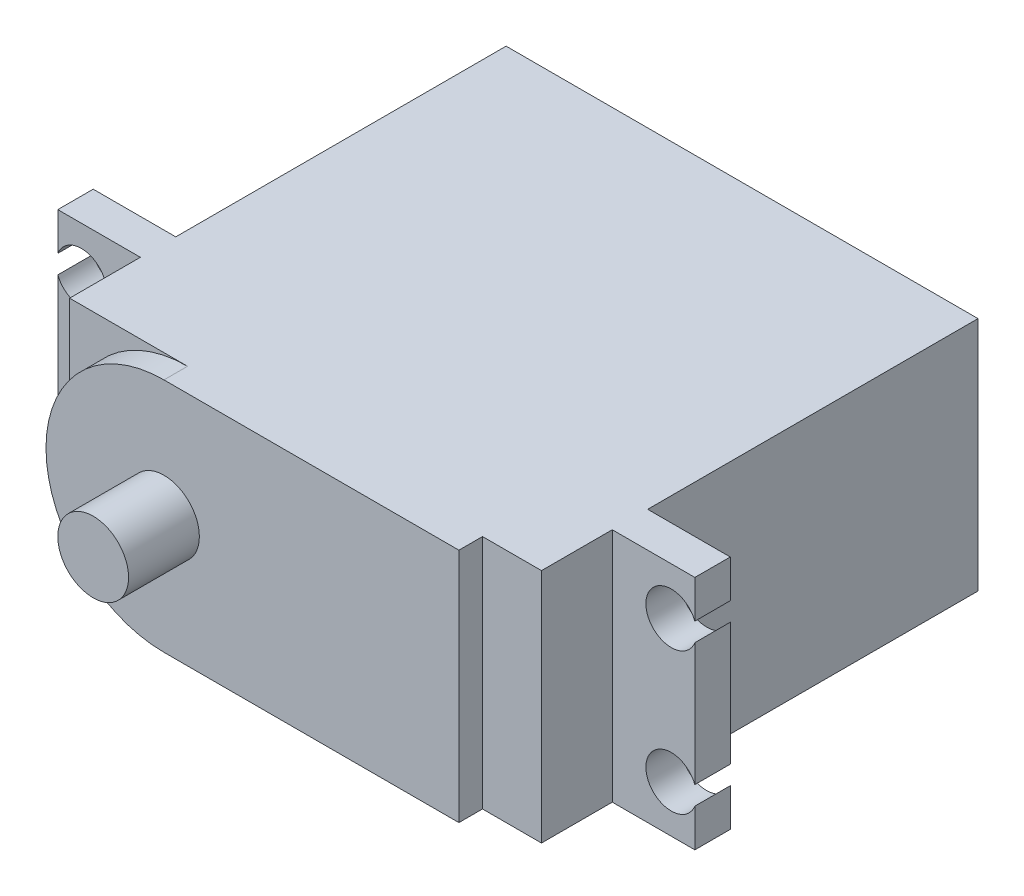
ISO-10303-21;
HEADER;
FILE_DESCRIPTION(('STEP AP214'),'2;1');
FILE_NAME('part.step','',(''),(''),'','','');
FILE_SCHEMA(('AUTOMOTIVE_DESIGN { 1 0 10303 214 1 1 1 1 }'));
ENDSEC;
DATA;
#1=APPLICATION_CONTEXT('core data for automotive mechanical design processes');
#2=APPLICATION_PROTOCOL_DEFINITION('international standard','automotive_design',2000,#1);
#3=PRODUCT_CONTEXT('',#1,'mechanical');
#4=PRODUCT('Part','Part','',(#3));
#5=PRODUCT_RELATED_PRODUCT_CATEGORY('part','',(#4));
#6=PRODUCT_DEFINITION_FORMATION('','',#4);
#7=PRODUCT_DEFINITION_CONTEXT('part definition',#1,'design');
#8=PRODUCT_DEFINITION('design','',#6,#7);
#9=PRODUCT_DEFINITION_SHAPE('','',#8);
#10=(LENGTH_UNIT() NAMED_UNIT(*) SI_UNIT(.MILLI.,.METRE.));
#11=(NAMED_UNIT(*) PLANE_ANGLE_UNIT() SI_UNIT($,.RADIAN.));
#12=(NAMED_UNIT(*) SI_UNIT($,.STERADIAN.) SOLID_ANGLE_UNIT());
#13=UNCERTAINTY_MEASURE_WITH_UNIT(LENGTH_MEASURE(1.E-05),#10,'distance_accuracy_value','');
#14=(GEOMETRIC_REPRESENTATION_CONTEXT(3) GLOBAL_UNCERTAINTY_ASSIGNED_CONTEXT((#13)) GLOBAL_UNIT_ASSIGNED_CONTEXT((#10,
#11,#12)) REPRESENTATION_CONTEXT('',''));
#15=CARTESIAN_POINT('',(0.,0.,0.));
#16=DIRECTION('',(0.,0.,1.));
#17=DIRECTION('',(1.,0.,0.));
#18=AXIS2_PLACEMENT_3D('',#15,#16,#17);
#19=CARTESIAN_POINT('',(27.,0.,0.));
#20=DIRECTION('',(1.,0.,0.));
#21=DIRECTION('',(0.,0.,-1.));
#22=AXIS2_PLACEMENT_3D('',#19,#20,#21);
#23=PLANE('',#22);
#24=DIRECTION('',(0.,0.,1.));
#25=VECTOR('',#24,1.);
#26=CARTESIAN_POINT('',(27.,-5.21101330809704,-0.001000000000001));
#27=LINE('',#26,#25);
#28=CARTESIAN_POINT('',(27.,-5.21101330809704,31.));
#29=VERTEX_POINT('',#28);
#30=CARTESIAN_POINT('',(27.,-5.21101330809704,28.));
#31=VERTEX_POINT('',#30);
#32=EDGE_CURVE('E203',#29,#31,#27,.F.);
#33=ORIENTED_EDGE('',*,*,#32,.T.);
#34=DIRECTION('',(0.,1.,0.));
#35=VECTOR('',#34,1.);
#36=CARTESIAN_POINT('',(27.,10.,28.));
#37=LINE('',#36,#35);
#38=CARTESIAN_POINT('',(27.,5.21101330809703,28.));
#39=VERTEX_POINT('',#38);
#40=EDGE_CURVE('E213',#31,#39,#37,.T.);
#41=ORIENTED_EDGE('',*,*,#40,.T.);
#42=DIRECTION('',(0.,0.,1.));
#43=VECTOR('',#42,1.);
#44=CARTESIAN_POINT('',(27.,5.21101330809703,-0.001000000000001));
#45=LINE('',#44,#43);
#46=CARTESIAN_POINT('',(27.,5.21101330809703,31.));
#47=VERTEX_POINT('',#46);
#48=EDGE_CURVE('E214',#39,#47,#45,.T.);
#49=ORIENTED_EDGE('',*,*,#48,.T.);
#50=DIRECTION('',(0.,-1.,0.));
#51=VECTOR('',#50,1.);
#52=CARTESIAN_POINT('',(27.,10.,31.));
#53=LINE('',#52,#51);
#54=EDGE_CURVE('E232',#47,#29,#53,.T.);
#55=ORIENTED_EDGE('',*,*,#54,.T.);
#56=EDGE_LOOP('',(#33,#41,#49,#55));
#57=FACE_BOUND('',#56,.T.);
#58=ADVANCED_FACE('F33',(#57),#23,.T.);
#59=DIRECTION('',(0.,0.,1.));
#60=VECTOR('',#59,1.);
#61=CARTESIAN_POINT('',(27.,6.78898669190296,-0.001000000000001));
#62=LINE('',#61,#60);
#63=CARTESIAN_POINT('',(27.,6.78898669190296,31.));
#64=VERTEX_POINT('',#63);
#65=CARTESIAN_POINT('',(27.,6.78898669190296,28.));
#66=VERTEX_POINT('',#65);
#67=EDGE_CURVE('E283',#64,#66,#62,.F.);
#68=ORIENTED_EDGE('',*,*,#67,.T.);
#69=CARTESIAN_POINT('',(27.,10.,28.));
#70=VERTEX_POINT('',#69);
#71=EDGE_CURVE('E222',#66,#70,#37,.T.);
#72=ORIENTED_EDGE('',*,*,#71,.T.);
#73=DIRECTION('',(0.,0.,1.));
#74=VECTOR('',#73,1.);
#75=CARTESIAN_POINT('',(27.,10.,31.));
#76=LINE('',#75,#74);
#77=CARTESIAN_POINT('',(27.,10.,31.));
#78=VERTEX_POINT('',#77);
#79=EDGE_CURVE('E220',#70,#78,#76,.T.);
#80=ORIENTED_EDGE('',*,*,#79,.T.);
#81=EDGE_CURVE('E230',#78,#64,#53,.T.);
#82=ORIENTED_EDGE('',*,*,#81,.T.);
#83=EDGE_LOOP('',(#68,#72,#80,#82));
#84=FACE_BOUND('',#83,.T.);
#85=ADVANCED_FACE('F424',(#84),#23,.T.);
#86=CARTESIAN_POINT('',(-27.,0.,0.));
#87=DIRECTION('',(-1.,0.,0.));
#88=DIRECTION('',(0.,0.,1.));
#89=AXIS2_PLACEMENT_3D('',#86,#87,#88);
#90=PLANE('',#89);
#91=DIRECTION('',(0.,0.,1.));
#92=VECTOR('',#91,1.);
#93=CARTESIAN_POINT('',(-27.,-6.78898669190297,-0.001000000000001));
#94=LINE('',#93,#92);
#95=CARTESIAN_POINT('',(-27.,-6.78898669190297,31.));
#96=VERTEX_POINT('',#95);
#97=CARTESIAN_POINT('',(-27.,-6.78898669190297,28.));
#98=VERTEX_POINT('',#97);
#99=EDGE_CURVE('E274',#96,#98,#94,.F.);
#100=ORIENTED_EDGE('',*,*,#99,.T.);
#101=DIRECTION('',(0.,-1.,0.));
#102=VECTOR('',#101,1.);
#103=CARTESIAN_POINT('',(-27.,10.,28.));
#104=LINE('',#103,#102);
#105=CARTESIAN_POINT('',(-27.,-10.,28.));
#106=VERTEX_POINT('',#105);
#107=EDGE_CURVE('E250',#98,#106,#104,.T.);
#108=ORIENTED_EDGE('',*,*,#107,.T.);
#109=DIRECTION('',(0.,0.,1.));
#110=VECTOR('',#109,1.);
#111=CARTESIAN_POINT('',(-27.,-10.,28.));
#112=LINE('',#111,#110);
#113=CARTESIAN_POINT('',(-27.,-10.,31.));
#114=VERTEX_POINT('',#113);
#115=EDGE_CURVE('E260',#106,#114,#112,.T.);
#116=ORIENTED_EDGE('',*,*,#115,.T.);
#117=DIRECTION('',(0.,1.,0.));
#118=VECTOR('',#117,1.);
#119=CARTESIAN_POINT('',(-27.,10.,31.));
#120=LINE('',#119,#118);
#121=EDGE_CURVE('E255',#114,#96,#120,.T.);
#122=ORIENTED_EDGE('',*,*,#121,.T.);
#123=EDGE_LOOP('',(#100,#108,#116,#122));
#124=FACE_BOUND('',#123,.T.);
#125=ADVANCED_FACE('F444',(#124),#90,.T.);
#126=DIRECTION('',(0.,0.,1.));
#127=VECTOR('',#126,1.);
#128=CARTESIAN_POINT('',(-27.,-5.21101330809704,-0.001000000000001));
#129=LINE('',#128,#127);
#130=CARTESIAN_POINT('',(-27.,-5.21101330809704,28.));
#131=VERTEX_POINT('',#130);
#132=CARTESIAN_POINT('',(-27.,-5.21101330809704,31.));
#133=VERTEX_POINT('',#132);
#134=EDGE_CURVE('E277',#131,#133,#129,.T.);
#135=ORIENTED_EDGE('',*,*,#134,.T.);
#136=CARTESIAN_POINT('',(-27.,5.21101330809703,31.));
#137=VERTEX_POINT('',#136);
#138=EDGE_CURVE('E258',#133,#137,#120,.T.);
#139=ORIENTED_EDGE('',*,*,#138,.T.);
#140=DIRECTION('',(0.,0.,1.));
#141=VECTOR('',#140,1.);
#142=CARTESIAN_POINT('',(-27.,5.21101330809703,24.));
#143=LINE('',#142,#141);
#144=CARTESIAN_POINT('',(-27.,5.21101330809703,28.));
#145=VERTEX_POINT('',#144);
#146=EDGE_CURVE('E11',#145,#137,#143,.T.);
#147=ORIENTED_EDGE('',*,*,#146,.F.);
#148=EDGE_CURVE('E265',#145,#131,#104,.T.);
#149=ORIENTED_EDGE('',*,*,#148,.T.);
#150=EDGE_LOOP('',(#135,#139,#147,#149));
#151=FACE_BOUND('',#150,.T.);
#152=ADVANCED_FACE('F479',(#151),#90,.T.);
#153=CARTESIAN_POINT('',(-20.,-10.,37.));
#154=DIRECTION('',(1.,0.,0.));
#155=DIRECTION('',(0.,0.,-1.));
#156=AXIS2_PLACEMENT_3D('',#153,#154,#155);
#157=PLANE('',#156);
#158=DIRECTION('',(0.,-1.,0.));
#159=VECTOR('',#158,1.);
#160=CARTESIAN_POINT('',(-20.,10.,28.));
#161=LINE('',#160,#159);
#162=CARTESIAN_POINT('',(-20.,10.,28.));
#163=VERTEX_POINT('',#162);
#164=CARTESIAN_POINT('',(-20.,-10.,28.));
#165=VERTEX_POINT('',#164);
#166=EDGE_CURVE('E251',#163,#165,#161,.T.);
#167=ORIENTED_EDGE('',*,*,#166,.F.);
#168=DIRECTION('',(0.,0.,-1.));
#169=VECTOR('',#168,1.);
#170=CARTESIAN_POINT('',(-20.,10.,37.));
#171=LINE('',#170,#169);
#172=CARTESIAN_POINT('',(-20.,10.,0.));
#173=VERTEX_POINT('',#172);
#174=EDGE_CURVE('E367',#163,#173,#171,.T.);
#175=ORIENTED_EDGE('',*,*,#174,.T.);
#176=DIRECTION('',(0.,-1.,0.));
#177=VECTOR('',#176,1.);
#178=CARTESIAN_POINT('',(-20.,-10.,0.));
#179=LINE('',#178,#177);
#180=CARTESIAN_POINT('',(-20.,-10.,0.));
#181=VERTEX_POINT('',#180);
#182=EDGE_CURVE('E356',#173,#181,#179,.T.);
#183=ORIENTED_EDGE('',*,*,#182,.T.);
#184=DIRECTION('',(0.,0.,-1.));
#185=VECTOR('',#184,1.);
#186=CARTESIAN_POINT('',(-20.,-10.,37.));
#187=LINE('',#186,#185);
#188=EDGE_CURVE('E363',#165,#181,#187,.T.);
#189=ORIENTED_EDGE('',*,*,#188,.F.);
#190=EDGE_LOOP('',(#167,#175,#183,#189));
#191=FACE_BOUND('',#190,.T.);
#192=ADVANCED_FACE('F476',(#191),#157,.F.);
#193=DIRECTION('',(0.,1.,0.));
#194=VECTOR('',#193,1.);
#195=CARTESIAN_POINT('',(-20.,10.,31.));
#196=LINE('',#195,#194);
#197=CARTESIAN_POINT('',(-20.,-10.,31.));
#198=VERTEX_POINT('',#197);
#199=CARTESIAN_POINT('',(-20.,10.,31.));
#200=VERTEX_POINT('',#199);
#201=EDGE_CURVE('E248',#198,#200,#196,.T.);
#202=ORIENTED_EDGE('',*,*,#201,.F.);
#203=CARTESIAN_POINT('',(-20.,-10.,37.));
#204=VERTEX_POINT('',#203);
#205=EDGE_CURVE('E364',#204,#198,#187,.T.);
#206=ORIENTED_EDGE('',*,*,#205,.F.);
#207=DIRECTION('',(0.,-1.,0.));
#208=VECTOR('',#207,1.);
#209=CARTESIAN_POINT('',(-20.,-10.,37.));
#210=LINE('',#209,#208);
#211=CARTESIAN_POINT('',(-20.,0.,37.));
#212=VERTEX_POINT('',#211);
#213=EDGE_CURVE('E347',#212,#204,#210,.T.);
#214=ORIENTED_EDGE('',*,*,#213,.F.);
#215=CARTESIAN_POINT('',(-20.,10.,37.));
#216=VERTEX_POINT('',#215);
#217=EDGE_CURVE('E348',#216,#212,#210,.T.);
#218=ORIENTED_EDGE('',*,*,#217,.F.);
#219=EDGE_CURVE('E368',#216,#200,#171,.T.);
#220=ORIENTED_EDGE('',*,*,#219,.T.);
#221=EDGE_LOOP('',(#202,#206,#214,#218,#220));
#222=FACE_BOUND('',#221,.T.);
#223=ADVANCED_FACE('F478',(#222),#157,.F.);
#224=CARTESIAN_POINT('',(20.,-10.,37.));
#225=DIRECTION('',(-1.,0.,0.));
#226=DIRECTION('',(0.,0.,1.));
#227=AXIS2_PLACEMENT_3D('',#224,#225,#226);
#228=PLANE('',#227);
#229=DIRECTION('',(0.,-1.,0.));
#230=VECTOR('',#229,1.);
#231=CARTESIAN_POINT('',(20.,10.,31.));
#232=LINE('',#231,#230);
#233=CARTESIAN_POINT('',(20.,10.,31.));
#234=VERTEX_POINT('',#233);
#235=CARTESIAN_POINT('',(20.,-10.,31.));
#236=VERTEX_POINT('',#235);
#237=EDGE_CURVE('E239',#234,#236,#232,.T.);
#238=ORIENTED_EDGE('',*,*,#237,.F.);
#239=DIRECTION('',(0.,0.,-1.));
#240=VECTOR('',#239,1.);
#241=CARTESIAN_POINT('',(20.,10.,37.));
#242=LINE('',#241,#240);
#243=CARTESIAN_POINT('',(20.,10.,37.));
#244=VERTEX_POINT('',#243);
#245=EDGE_CURVE('E372',#244,#234,#242,.T.);
#246=ORIENTED_EDGE('',*,*,#245,.F.);
#247=DIRECTION('',(0.,1.,0.));
#248=VECTOR('',#247,1.);
#249=CARTESIAN_POINT('',(20.,-10.,37.));
#250=LINE('',#249,#248);
#251=CARTESIAN_POINT('',(20.,-10.,37.));
#252=VERTEX_POINT('',#251);
#253=EDGE_CURVE('E341',#252,#244,#250,.T.);
#254=ORIENTED_EDGE('',*,*,#253,.F.);
#255=DIRECTION('',(0.,0.,-1.));
#256=VECTOR('',#255,1.);
#257=CARTESIAN_POINT('',(20.,-10.,37.));
#258=LINE('',#257,#256);
#259=EDGE_CURVE('E361',#252,#236,#258,.T.);
#260=ORIENTED_EDGE('',*,*,#259,.T.);
#261=EDGE_LOOP('',(#238,#246,#254,#260));
#262=FACE_BOUND('',#261,.T.);
#263=ADVANCED_FACE('F35',(#262),#228,.F.);
#264=DIRECTION('',(0.,1.,0.));
#265=VECTOR('',#264,1.);
#266=CARTESIAN_POINT('',(20.,10.,28.));
#267=LINE('',#266,#265);
#268=CARTESIAN_POINT('',(20.,-10.,28.));
#269=VERTEX_POINT('',#268);
#270=CARTESIAN_POINT('',(20.,10.,28.));
#271=VERTEX_POINT('',#270);
#272=EDGE_CURVE('E418',#269,#271,#267,.T.);
#273=ORIENTED_EDGE('',*,*,#272,.F.);
#274=CARTESIAN_POINT('',(20.,-10.,0.));
#275=VERTEX_POINT('',#274);
#276=EDGE_CURVE('E353',#269,#275,#258,.T.);
#277=ORIENTED_EDGE('',*,*,#276,.T.);
#278=DIRECTION('',(0.,1.,0.));
#279=VECTOR('',#278,1.);
#280=CARTESIAN_POINT('',(20.,-10.,0.));
#281=LINE('',#280,#279);
#282=CARTESIAN_POINT('',(20.,10.,0.));
#283=VERTEX_POINT('',#282);
#284=EDGE_CURVE('E330',#275,#283,#281,.T.);
#285=ORIENTED_EDGE('',*,*,#284,.T.);
#286=EDGE_CURVE('E371',#271,#283,#242,.T.);
#287=ORIENTED_EDGE('',*,*,#286,.F.);
#288=EDGE_LOOP('',(#273,#277,#285,#287));
#289=FACE_BOUND('',#288,.T.);
#290=ADVANCED_FACE('F490',(#289),#228,.F.);
#291=CARTESIAN_POINT('',(0.,0.,37.));
#292=DIRECTION('',(0.,0.,-1.));
#293=DIRECTION('',(-1.,0.,0.));
#294=AXIS2_PLACEMENT_3D('',#291,#292,#293);
#295=PLANE('',#294);
#296=DIRECTION('',(0.,1.,0.));
#297=VECTOR('',#296,1.);
#298=CARTESIAN_POINT('',(15.,10.,37.));
#299=LINE('',#298,#297);
#300=CARTESIAN_POINT('',(15.,-10.,37.));
#301=VERTEX_POINT('',#300);
#302=CARTESIAN_POINT('',(15.,10.,37.));
#303=VERTEX_POINT('',#302);
#304=EDGE_CURVE('E319',#301,#303,#299,.T.);
#305=ORIENTED_EDGE('',*,*,#304,.F.);
#306=DIRECTION('',(1.,0.,0.));
#307=VECTOR('',#306,1.);
#308=CARTESIAN_POINT('',(-20.,-10.,37.));
#309=LINE('',#308,#307);
#310=EDGE_CURVE('E351',#301,#252,#309,.T.);
#311=ORIENTED_EDGE('',*,*,#310,.T.);
#312=ORIENTED_EDGE('',*,*,#253,.T.);
#313=DIRECTION('',(-1.,0.,0.));
#314=VECTOR('',#313,1.);
#315=CARTESIAN_POINT('',(-20.,10.,37.));
#316=LINE('',#315,#314);
#317=EDGE_CURVE('E345',#244,#303,#316,.T.);
#318=ORIENTED_EDGE('',*,*,#317,.T.);
#319=EDGE_LOOP('',(#305,#311,#312,#318));
#320=FACE_BOUND('',#319,.T.);
#321=ADVANCED_FACE('F407',(#320),#295,.F.);
#322=CARTESIAN_POINT('',(-10.,0.,37.));
#323=DIRECTION('',(0.,0.,1.));
#324=DIRECTION('',(1.,0.,0.));
#325=AXIS2_PLACEMENT_3D('',#322,#323,#324);
#326=CIRCLE('',#325,10.);
#327=CARTESIAN_POINT('',(-10.,10.,37.));
#328=VERTEX_POINT('',#327);
#329=EDGE_CURVE('E379',#328,#212,#326,.T.);
#330=ORIENTED_EDGE('',*,*,#329,.F.);
#331=EDGE_CURVE('E327',#328,#216,#316,.T.);
#332=ORIENTED_EDGE('',*,*,#331,.T.);
#333=ORIENTED_EDGE('',*,*,#217,.T.);
#334=EDGE_LOOP('',(#330,#332,#333));
#335=FACE_BOUND('',#334,.T.);
#336=ADVANCED_FACE('F470',(#335),#295,.F.);
#337=CARTESIAN_POINT('',(-20.,10.,37.));
#338=DIRECTION('',(0.,-1.,0.));
#339=DIRECTION('',(0.,0.,-1.));
#340=AXIS2_PLACEMENT_3D('',#337,#338,#339);
#341=PLANE('',#340);
#342=DIRECTION('',(-1.,0.,0.));
#343=VECTOR('',#342,1.);
#344=CARTESIAN_POINT('',(-20.,10.,0.));
#345=LINE('',#344,#343);
#346=EDGE_CURVE('E334',#283,#173,#345,.T.);
#347=ORIENTED_EDGE('',*,*,#346,.T.);
#348=ORIENTED_EDGE('',*,*,#174,.F.);
#349=DIRECTION('',(1.,0.,0.));
#350=VECTOR('',#349,1.);
#351=CARTESIAN_POINT('',(-27.,10.,28.));
#352=LINE('',#351,#350);
#353=CARTESIAN_POINT('',(-27.,10.,28.));
#354=VERTEX_POINT('',#353);
#355=EDGE_CURVE('E245',#354,#163,#352,.T.);
#356=ORIENTED_EDGE('',*,*,#355,.F.);
#357=DIRECTION('',(0.,0.,-1.));
#358=VECTOR('',#357,1.);
#359=CARTESIAN_POINT('',(-27.,10.,28.));
#360=LINE('',#359,#358);
#361=CARTESIAN_POINT('',(-27.,10.,31.));
#362=VERTEX_POINT('',#361);
#363=EDGE_CURVE('E247',#362,#354,#360,.T.);
#364=ORIENTED_EDGE('',*,*,#363,.F.);
#365=DIRECTION('',(1.,0.,0.));
#366=VECTOR('',#365,1.);
#367=CARTESIAN_POINT('',(-27.,10.,31.));
#368=LINE('',#367,#366);
#369=EDGE_CURVE('E242',#362,#200,#368,.T.);
#370=ORIENTED_EDGE('',*,*,#369,.T.);
#371=ORIENTED_EDGE('',*,*,#219,.F.);
#372=ORIENTED_EDGE('',*,*,#331,.F.);
#373=DIRECTION('',(0.,0.,-1.));
#374=VECTOR('',#373,1.);
#375=CARTESIAN_POINT('',(-10.,10.,39.));
#376=LINE('',#375,#374);
#377=CARTESIAN_POINT('',(-10.,10.,39.));
#378=VERTEX_POINT('',#377);
#379=EDGE_CURVE('E323',#378,#328,#376,.T.);
#380=ORIENTED_EDGE('',*,*,#379,.F.);
#381=DIRECTION('',(-1.,0.,0.));
#382=VECTOR('',#381,1.);
#383=CARTESIAN_POINT('',(-10.,10.,39.));
#384=LINE('',#383,#382);
#385=CARTESIAN_POINT('',(15.,10.,39.));
#386=VERTEX_POINT('',#385);
#387=EDGE_CURVE('E310',#386,#378,#384,.T.);
#388=ORIENTED_EDGE('',*,*,#387,.F.);
#389=DIRECTION('',(0.,0.,-1.));
#390=VECTOR('',#389,1.);
#391=CARTESIAN_POINT('',(15.,10.,39.));
#392=LINE('',#391,#390);
#393=EDGE_CURVE('E397',#386,#303,#392,.T.);
#394=ORIENTED_EDGE('',*,*,#393,.T.);
#395=ORIENTED_EDGE('',*,*,#317,.F.);
#396=ORIENTED_EDGE('',*,*,#245,.T.);
#397=DIRECTION('',(-1.,0.,0.));
#398=VECTOR('',#397,1.);
#399=CARTESIAN_POINT('',(27.,10.,31.));
#400=LINE('',#399,#398);
#401=EDGE_CURVE('E223',#78,#234,#400,.T.);
#402=ORIENTED_EDGE('',*,*,#401,.F.);
#403=ORIENTED_EDGE('',*,*,#79,.F.);
#404=DIRECTION('',(-1.,0.,0.));
#405=VECTOR('',#404,1.);
#406=CARTESIAN_POINT('',(27.,10.,28.));
#407=LINE('',#406,#405);
#408=EDGE_CURVE('E391',#70,#271,#407,.T.);
#409=ORIENTED_EDGE('',*,*,#408,.T.);
#410=ORIENTED_EDGE('',*,*,#286,.T.);
#411=EDGE_LOOP('',(#347,#348,#356,#364,#370,#371,#372,#380,#388,#394,#395,#396,#402,#403,#409,#410));
#412=FACE_BOUND('',#411,.T.);
#413=ADVANCED_FACE('F325',(#412),#341,.F.);
#414=CARTESIAN_POINT('',(-20.,-10.,37.));
#415=DIRECTION('',(0.,1.,0.));
#416=DIRECTION('',(0.,0.,1.));
#417=AXIS2_PLACEMENT_3D('',#414,#415,#416);
#418=PLANE('',#417);
#419=DIRECTION('',(1.,0.,0.));
#420=VECTOR('',#419,1.);
#421=CARTESIAN_POINT('',(-20.,-10.,0.));
#422=LINE('',#421,#420);
#423=EDGE_CURVE('E344',#181,#275,#422,.T.);
#424=ORIENTED_EDGE('',*,*,#423,.T.);
#425=ORIENTED_EDGE('',*,*,#276,.F.);
#426=DIRECTION('',(-1.,0.,0.));
#427=VECTOR('',#426,1.);
#428=CARTESIAN_POINT('',(27.,-10.,28.));
#429=LINE('',#428,#427);
#430=CARTESIAN_POINT('',(27.,-10.,28.));
#431=VERTEX_POINT('',#430);
#432=EDGE_CURVE('E385',#431,#269,#429,.T.);
#433=ORIENTED_EDGE('',*,*,#432,.F.);
#434=DIRECTION('',(0.,0.,-1.));
#435=VECTOR('',#434,1.);
#436=CARTESIAN_POINT('',(27.,-10.,31.));
#437=LINE('',#436,#435);
#438=CARTESIAN_POINT('',(27.,-10.,31.));
#439=VERTEX_POINT('',#438);
#440=EDGE_CURVE('E218',#439,#431,#437,.T.);
#441=ORIENTED_EDGE('',*,*,#440,.F.);
#442=DIRECTION('',(-1.,0.,0.));
#443=VECTOR('',#442,1.);
#444=CARTESIAN_POINT('',(27.,-10.,31.));
#445=LINE('',#444,#443);
#446=EDGE_CURVE('E382',#439,#236,#445,.T.);
#447=ORIENTED_EDGE('',*,*,#446,.T.);
#448=ORIENTED_EDGE('',*,*,#259,.F.);
#449=ORIENTED_EDGE('',*,*,#310,.F.);
#450=DIRECTION('',(0.,0.,-1.));
#451=VECTOR('',#450,1.);
#452=CARTESIAN_POINT('',(15.,-10.,39.));
#453=LINE('',#452,#451);
#454=CARTESIAN_POINT('',(15.,-10.,39.));
#455=VERTEX_POINT('',#454);
#456=EDGE_CURVE('E337',#455,#301,#453,.T.);
#457=ORIENTED_EDGE('',*,*,#456,.F.);
#458=DIRECTION('',(1.,0.,0.));
#459=VECTOR('',#458,1.);
#460=CARTESIAN_POINT('',(-10.,-10.,39.));
#461=LINE('',#460,#459);
#462=CARTESIAN_POINT('',(-10.,-10.,39.));
#463=VERTEX_POINT('',#462);
#464=EDGE_CURVE('E396',#463,#455,#461,.T.);
#465=ORIENTED_EDGE('',*,*,#464,.F.);
#466=DIRECTION('',(0.,0.,-1.));
#467=VECTOR('',#466,1.);
#468=CARTESIAN_POINT('',(-10.,-10.,39.));
#469=LINE('',#468,#467);
#470=CARTESIAN_POINT('',(-10.,-10.,37.));
#471=VERTEX_POINT('',#470);
#472=EDGE_CURVE('E331',#463,#471,#469,.T.);
#473=ORIENTED_EDGE('',*,*,#472,.T.);
#474=EDGE_CURVE('E352',#204,#471,#309,.T.);
#475=ORIENTED_EDGE('',*,*,#474,.F.);
#476=ORIENTED_EDGE('',*,*,#205,.T.);
#477=DIRECTION('',(1.,0.,0.));
#478=VECTOR('',#477,1.);
#479=CARTESIAN_POINT('',(-27.,-10.,31.));
#480=LINE('',#479,#478);
#481=EDGE_CURVE('E240',#114,#198,#480,.T.);
#482=ORIENTED_EDGE('',*,*,#481,.F.);
#483=ORIENTED_EDGE('',*,*,#115,.F.);
#484=DIRECTION('',(1.,0.,0.));
#485=VECTOR('',#484,1.);
#486=CARTESIAN_POINT('',(-27.,-10.,28.));
#487=LINE('',#486,#485);
#488=EDGE_CURVE('E236',#106,#165,#487,.T.);
#489=ORIENTED_EDGE('',*,*,#488,.T.);
#490=ORIENTED_EDGE('',*,*,#188,.T.);
#491=EDGE_LOOP('',(#424,#425,#433,#441,#447,#448,#449,#457,#465,#473,#475,#476,#482,#483,#489,#490));
#492=FACE_BOUND('',#491,.T.);
#493=ADVANCED_FACE('F404',(#492),#418,.F.);
#494=EDGE_CURVE('E374',#212,#471,#326,.T.);
#495=ORIENTED_EDGE('',*,*,#494,.F.);
#496=ORIENTED_EDGE('',*,*,#213,.T.);
#497=ORIENTED_EDGE('',*,*,#474,.T.);
#498=EDGE_LOOP('',(#495,#496,#497));
#499=FACE_BOUND('',#498,.T.);
#500=ADVANCED_FACE('F466',(#499),#295,.F.);
#501=CARTESIAN_POINT('',(0.,0.,0.));
#502=DIRECTION('',(0.,0.,-1.));
#503=DIRECTION('',(-1.,0.,0.));
#504=AXIS2_PLACEMENT_3D('',#501,#502,#503);
#505=PLANE('',#504);
#506=ORIENTED_EDGE('',*,*,#284,.F.);
#507=ORIENTED_EDGE('',*,*,#423,.F.);
#508=ORIENTED_EDGE('',*,*,#182,.F.);
#509=ORIENTED_EDGE('',*,*,#346,.F.);
#510=EDGE_LOOP('',(#506,#507,#508,#509));
#511=FACE_BOUND('',#510,.T.);
#512=ADVANCED_FACE('F465',(#511),#505,.T.);
#513=CARTESIAN_POINT('',(-10.,0.,39.));
#514=DIRECTION('',(0.,0.,-1.));
#515=DIRECTION('',(-1.,0.,0.));
#516=AXIS2_PLACEMENT_3D('',#513,#514,#515);
#517=CYLINDRICAL_SURFACE('',#516,10.);
#518=ORIENTED_EDGE('',*,*,#329,.T.);
#519=ORIENTED_EDGE('',*,*,#494,.T.);
#520=ORIENTED_EDGE('',*,*,#472,.F.);
#521=CARTESIAN_POINT('',(-10.,0.,39.));
#522=DIRECTION('',(0.,0.,1.));
#523=DIRECTION('',(1.,0.,0.));
#524=AXIS2_PLACEMENT_3D('',#521,#522,#523);
#525=CIRCLE('',#524,10.);
#526=EDGE_CURVE('E312',#378,#463,#525,.T.);
#527=ORIENTED_EDGE('',*,*,#526,.F.);
#528=ORIENTED_EDGE('',*,*,#379,.T.);
#529=EDGE_LOOP('',(#518,#519,#520,#527,#528));
#530=FACE_BOUND('',#529,.T.);
#531=ADVANCED_FACE('F462',(#530),#517,.T.);
#532=CARTESIAN_POINT('',(15.,10.,39.));
#533=DIRECTION('',(-1.,0.,0.));
#534=DIRECTION('',(0.,-1.,0.));
#535=AXIS2_PLACEMENT_3D('',#532,#533,#534);
#536=PLANE('',#535);
#537=ORIENTED_EDGE('',*,*,#304,.T.);
#538=ORIENTED_EDGE('',*,*,#393,.F.);
#539=DIRECTION('',(0.,1.,0.));
#540=VECTOR('',#539,1.);
#541=CARTESIAN_POINT('',(15.,10.,39.));
#542=LINE('',#541,#540);
#543=EDGE_CURVE('E315',#455,#386,#542,.T.);
#544=ORIENTED_EDGE('',*,*,#543,.F.);
#545=ORIENTED_EDGE('',*,*,#456,.T.);
#546=EDGE_LOOP('',(#537,#538,#544,#545));
#547=FACE_BOUND('',#546,.T.);
#548=ADVANCED_FACE('F306',(#547),#536,.F.);
#549=CARTESIAN_POINT('',(-10.,0.,39.));
#550=DIRECTION('',(0.,0.,1.));
#551=DIRECTION('',(1.,0.,0.));
#552=AXIS2_PLACEMENT_3D('',#549,#550,#551);
#553=PLANE('',#552);
#554=CARTESIAN_POINT('',(-10.,0.,39.));
#555=DIRECTION('',(0.,0.,1.));
#556=DIRECTION('',(1.,0.,0.));
#557=AXIS2_PLACEMENT_3D('',#554,#555,#556);
#558=CIRCLE('',#557,3.);
#559=CARTESIAN_POINT('',(-7.,0.,39.));
#560=VERTEX_POINT('',#559);
#561=EDGE_CURVE('E288',#560,#560,#558,.T.);
#562=ORIENTED_EDGE('',*,*,#561,.F.);
#563=EDGE_LOOP('',(#562));
#564=FACE_BOUND('',#563,.T.);
#565=ORIENTED_EDGE('',*,*,#387,.T.);
#566=ORIENTED_EDGE('',*,*,#526,.T.);
#567=ORIENTED_EDGE('',*,*,#464,.T.);
#568=ORIENTED_EDGE('',*,*,#543,.T.);
#569=EDGE_LOOP('',(#565,#566,#567,#568));
#570=FACE_BOUND('',#569,.T.);
#571=ADVANCED_FACE('F302',(#564,#570),#553,.T.);
#572=CARTESIAN_POINT('',(27.,10.,31.));
#573=DIRECTION('',(0.,0.,-1.));
#574=DIRECTION('',(0.,1.,0.));
#575=AXIS2_PLACEMENT_3D('',#572,#573,#574);
#576=PLANE('',#575);
#577=CARTESIAN_POINT('',(27.,-6.78898669190297,31.));
#578=VERTEX_POINT('',#577);
#579=EDGE_CURVE('E234',#578,#439,#53,.T.);
#580=ORIENTED_EDGE('',*,*,#579,.F.);
#581=CARTESIAN_POINT('',(25.,-6.,31.));
#582=DIRECTION('',(0.,0.,1.));
#583=DIRECTION('',(1.,0.,0.));
#584=AXIS2_PLACEMENT_3D('',#581,#582,#583);
#585=CIRCLE('',#584,2.15);
#586=EDGE_CURVE('E48',#29,#578,#585,.T.);
#587=ORIENTED_EDGE('',*,*,#586,.F.);
#588=ORIENTED_EDGE('',*,*,#54,.F.);
#589=CARTESIAN_POINT('',(25.,6.,31.));
#590=DIRECTION('',(0.,0.,1.));
#591=DIRECTION('',(1.,0.,0.));
#592=AXIS2_PLACEMENT_3D('',#589,#590,#591);
#593=CIRCLE('',#592,2.15);
#594=EDGE_CURVE('E56',#64,#47,#593,.T.);
#595=ORIENTED_EDGE('',*,*,#594,.F.);
#596=ORIENTED_EDGE('',*,*,#81,.F.);
#597=ORIENTED_EDGE('',*,*,#401,.T.);
#598=ORIENTED_EDGE('',*,*,#237,.T.);
#599=ORIENTED_EDGE('',*,*,#446,.F.);
#600=EDGE_LOOP('',(#580,#587,#588,#595,#596,#597,#598,#599));
#601=FACE_BOUND('',#600,.T.);
#602=ADVANCED_FACE('F305',(#601),#576,.F.);
#603=CARTESIAN_POINT('',(27.,10.,28.));
#604=DIRECTION('',(0.,0.,1.));
#605=DIRECTION('',(0.,-1.,0.));
#606=AXIS2_PLACEMENT_3D('',#603,#604,#605);
#607=PLANE('',#606);
#608=ORIENTED_EDGE('',*,*,#40,.F.);
#609=CARTESIAN_POINT('',(25.,-6.,28.));
#610=DIRECTION('',(0.,0.,1.));
#611=DIRECTION('',(0.,-1.,0.));
#612=AXIS2_PLACEMENT_3D('',#609,#610,#611);
#613=CIRCLE('',#612,2.15);
#614=CARTESIAN_POINT('',(27.,-6.78898669190297,28.));
#615=VERTEX_POINT('',#614);
#616=EDGE_CURVE('E198',#615,#31,#613,.F.);
#617=ORIENTED_EDGE('',*,*,#616,.F.);
#618=EDGE_CURVE('E211',#431,#615,#37,.T.);
#619=ORIENTED_EDGE('',*,*,#618,.F.);
#620=ORIENTED_EDGE('',*,*,#432,.T.);
#621=ORIENTED_EDGE('',*,*,#272,.T.);
#622=ORIENTED_EDGE('',*,*,#408,.F.);
#623=ORIENTED_EDGE('',*,*,#71,.F.);
#624=CARTESIAN_POINT('',(25.,6.,28.));
#625=DIRECTION('',(0.,0.,1.));
#626=DIRECTION('',(0.,-1.,0.));
#627=AXIS2_PLACEMENT_3D('',#624,#625,#626);
#628=CIRCLE('',#627,2.15);
#629=EDGE_CURVE('E280',#39,#66,#628,.F.);
#630=ORIENTED_EDGE('',*,*,#629,.F.);
#631=EDGE_LOOP('',(#608,#617,#619,#620,#621,#622,#623,#630));
#632=FACE_BOUND('',#631,.T.);
#633=ADVANCED_FACE('F209',(#632),#607,.F.);
#634=DIRECTION('',(0.,0.,1.));
#635=VECTOR('',#634,1.);
#636=CARTESIAN_POINT('',(27.,-6.78898669190297,-0.001000000000001));
#637=LINE('',#636,#635);
#638=EDGE_CURVE('E195',#615,#578,#637,.T.);
#639=ORIENTED_EDGE('',*,*,#638,.T.);
#640=ORIENTED_EDGE('',*,*,#579,.T.);
#641=ORIENTED_EDGE('',*,*,#440,.T.);
#642=ORIENTED_EDGE('',*,*,#618,.T.);
#643=EDGE_LOOP('',(#639,#640,#641,#642));
#644=FACE_BOUND('',#643,.T.);
#645=ADVANCED_FACE('F216',(#644),#23,.T.);
#646=CARTESIAN_POINT('',(-27.,10.,28.));
#647=DIRECTION('',(0.,0.,1.));
#648=DIRECTION('',(1.,0.,0.));
#649=AXIS2_PLACEMENT_3D('',#646,#647,#648);
#650=PLANE('',#649);
#651=ORIENTED_EDGE('',*,*,#107,.F.);
#652=CARTESIAN_POINT('',(-25.,-6.,28.));
#653=DIRECTION('',(0.,0.,1.));
#654=DIRECTION('',(1.,0.,0.));
#655=AXIS2_PLACEMENT_3D('',#652,#653,#654);
#656=CIRCLE('',#655,2.15);
#657=EDGE_CURVE('E270',#131,#98,#656,.F.);
#658=ORIENTED_EDGE('',*,*,#657,.F.);
#659=ORIENTED_EDGE('',*,*,#148,.F.);
#660=CARTESIAN_POINT('',(-25.,6.,28.));
#661=DIRECTION('',(0.,0.,1.));
#662=DIRECTION('',(1.,0.,0.));
#663=AXIS2_PLACEMENT_3D('',#660,#661,#662);
#664=CIRCLE('',#663,2.15);
#665=CARTESIAN_POINT('',(-27.,6.78898669190296,28.));
#666=VERTEX_POINT('',#665);
#667=EDGE_CURVE('E253',#145,#666,#664,.T.);
#668=ORIENTED_EDGE('',*,*,#667,.T.);
#669=EDGE_CURVE('E262',#354,#666,#104,.T.);
#670=ORIENTED_EDGE('',*,*,#669,.F.);
#671=ORIENTED_EDGE('',*,*,#355,.T.);
#672=ORIENTED_EDGE('',*,*,#166,.T.);
#673=ORIENTED_EDGE('',*,*,#488,.F.);
#674=EDGE_LOOP('',(#651,#658,#659,#668,#670,#671,#672,#673));
#675=FACE_BOUND('',#674,.T.);
#676=ADVANCED_FACE('F448',(#675),#650,.F.);
#677=CARTESIAN_POINT('',(-27.,10.,31.));
#678=DIRECTION('',(0.,0.,-1.));
#679=DIRECTION('',(0.,1.,0.));
#680=AXIS2_PLACEMENT_3D('',#677,#678,#679);
#681=PLANE('',#680);
#682=ORIENTED_EDGE('',*,*,#138,.F.);
#683=CARTESIAN_POINT('',(-25.,-6.,31.));
#684=DIRECTION('',(0.,0.,1.));
#685=DIRECTION('',(1.,0.,0.));
#686=AXIS2_PLACEMENT_3D('',#683,#684,#685);
#687=CIRCLE('',#686,2.15);
#688=EDGE_CURVE('E272',#96,#133,#687,.T.);
#689=ORIENTED_EDGE('',*,*,#688,.F.);
#690=ORIENTED_EDGE('',*,*,#121,.F.);
#691=ORIENTED_EDGE('',*,*,#481,.T.);
#692=ORIENTED_EDGE('',*,*,#201,.T.);
#693=ORIENTED_EDGE('',*,*,#369,.F.);
#694=CARTESIAN_POINT('',(-27.,6.78898669190296,31.));
#695=VERTEX_POINT('',#694);
#696=EDGE_CURVE('E259',#695,#362,#120,.T.);
#697=ORIENTED_EDGE('',*,*,#696,.F.);
#698=CARTESIAN_POINT('',(-25.,6.,31.));
#699=DIRECTION('',(0.,0.,1.));
#700=DIRECTION('',(1.,0.,0.));
#701=AXIS2_PLACEMENT_3D('',#698,#699,#700);
#702=CIRCLE('',#701,2.15);
#703=EDGE_CURVE('E268',#137,#695,#702,.T.);
#704=ORIENTED_EDGE('',*,*,#703,.F.);
#705=EDGE_LOOP('',(#682,#689,#690,#691,#692,#693,#697,#704));
#706=FACE_BOUND('',#705,.T.);
#707=ADVANCED_FACE('F453',(#706),#681,.F.);
#708=DIRECTION('',(0.,0.,1.));
#709=VECTOR('',#708,1.);
#710=CARTESIAN_POINT('',(-27.,6.78898669190296,24.));
#711=LINE('',#710,#709);
#712=EDGE_CURVE('E41',#695,#666,#711,.F.);
#713=ORIENTED_EDGE('',*,*,#712,.F.);
#714=ORIENTED_EDGE('',*,*,#696,.T.);
#715=ORIENTED_EDGE('',*,*,#363,.T.);
#716=ORIENTED_EDGE('',*,*,#669,.T.);
#717=EDGE_LOOP('',(#713,#714,#715,#716));
#718=FACE_BOUND('',#717,.T.);
#719=ADVANCED_FACE('F513',(#718),#90,.T.);
#720=CARTESIAN_POINT('',(-25.,6.,24.));
#721=DIRECTION('',(0.,0.,1.));
#722=DIRECTION('',(1.,0.,0.));
#723=AXIS2_PLACEMENT_3D('',#720,#721,#722);
#724=CYLINDRICAL_SURFACE('',#723,2.15);
#725=ORIENTED_EDGE('',*,*,#146,.T.);
#726=ORIENTED_EDGE('',*,*,#703,.T.);
#727=ORIENTED_EDGE('',*,*,#712,.T.);
#728=ORIENTED_EDGE('',*,*,#667,.F.);
#729=EDGE_LOOP('',(#725,#726,#727,#728));
#730=FACE_BOUND('',#729,.T.);
#731=ADVANCED_FACE('F435',(#730),#724,.F.);
#732=CARTESIAN_POINT('',(-25.,-6.,-0.001000000000001));
#733=DIRECTION('',(0.,0.,1.));
#734=DIRECTION('',(1.,0.,0.));
#735=AXIS2_PLACEMENT_3D('',#732,#733,#734);
#736=CYLINDRICAL_SURFACE('',#735,2.15);
#737=ORIENTED_EDGE('',*,*,#688,.T.);
#738=ORIENTED_EDGE('',*,*,#134,.F.);
#739=ORIENTED_EDGE('',*,*,#657,.T.);
#740=ORIENTED_EDGE('',*,*,#99,.F.);
#741=EDGE_LOOP('',(#737,#738,#739,#740));
#742=FACE_BOUND('',#741,.T.);
#743=ADVANCED_FACE('F428',(#742),#736,.F.);
#744=CARTESIAN_POINT('',(25.,6.,-0.001000000000001));
#745=DIRECTION('',(0.,0.,1.));
#746=DIRECTION('',(1.,0.,0.));
#747=AXIS2_PLACEMENT_3D('',#744,#745,#746);
#748=CYLINDRICAL_SURFACE('',#747,2.15);
#749=ORIENTED_EDGE('',*,*,#594,.T.);
#750=ORIENTED_EDGE('',*,*,#48,.F.);
#751=ORIENTED_EDGE('',*,*,#629,.T.);
#752=ORIENTED_EDGE('',*,*,#67,.F.);
#753=EDGE_LOOP('',(#749,#750,#751,#752));
#754=FACE_BOUND('',#753,.T.);
#755=ADVANCED_FACE('F426',(#754),#748,.F.);
#756=CARTESIAN_POINT('',(25.,-6.,-0.001000000000001));
#757=DIRECTION('',(0.,0.,1.));
#758=DIRECTION('',(1.,0.,0.));
#759=AXIS2_PLACEMENT_3D('',#756,#757,#758);
#760=CYLINDRICAL_SURFACE('',#759,2.15);
#761=ORIENTED_EDGE('',*,*,#586,.T.);
#762=ORIENTED_EDGE('',*,*,#638,.F.);
#763=ORIENTED_EDGE('',*,*,#616,.T.);
#764=ORIENTED_EDGE('',*,*,#32,.F.);
#765=EDGE_LOOP('',(#761,#762,#763,#764));
#766=FACE_BOUND('',#765,.T.);
#767=ADVANCED_FACE('F197',(#766),#760,.F.);
#768=CARTESIAN_POINT('',(-10.,0.,45.));
#769=DIRECTION('',(0.,0.,-1.));
#770=DIRECTION('',(-1.,0.,0.));
#771=AXIS2_PLACEMENT_3D('',#768,#769,#770);
#772=CYLINDRICAL_SURFACE('',#771,3.);
#773=CARTESIAN_POINT('',(-10.,0.,45.));
#774=DIRECTION('',(0.,0.,1.));
#775=DIRECTION('',(1.,0.,0.));
#776=AXIS2_PLACEMENT_3D('',#773,#774,#775);
#777=CIRCLE('',#776,3.);
#778=CARTESIAN_POINT('',(-7.,0.,45.));
#779=VERTEX_POINT('',#778);
#780=EDGE_CURVE('E204',#779,#779,#777,.T.);
#781=ORIENTED_EDGE('',*,*,#780,.F.);
#782=EDGE_LOOP('',(#781));
#783=FACE_BOUND('',#782,.T.);
#784=ORIENTED_EDGE('',*,*,#561,.T.);
#785=EDGE_LOOP('',(#784));
#786=FACE_BOUND('',#785,.T.);
#787=ADVANCED_FACE('F296',(#783,#786),#772,.T.);
#788=CARTESIAN_POINT('',(-10.,0.,45.));
#789=DIRECTION('',(0.,0.,1.));
#790=DIRECTION('',(1.,0.,0.));
#791=AXIS2_PLACEMENT_3D('',#788,#789,#790);
#792=PLANE('',#791);
#793=ORIENTED_EDGE('',*,*,#780,.T.);
#794=EDGE_LOOP('',(#793));
#795=FACE_BOUND('',#794,.T.);
#796=ADVANCED_FACE('F294',(#795),#792,.T.);
#797=CLOSED_SHELL('',(#58,#85,#125,#152,#192,#223,#263,#290,#321,#336,#413,#493,#500,#512,#531,
#548,#571,#602,#633,#645,#676,#707,#719,#731,#743,#755,#767,#787,#796));
#798=MANIFOLD_SOLID_BREP('B2',#797);
#799=ADVANCED_BREP_SHAPE_REPRESENTATION('',(#18,#798),#14);
#800=SHAPE_DEFINITION_REPRESENTATION(#9,#799);
ENDSEC;
END-ISO-10303-21;
